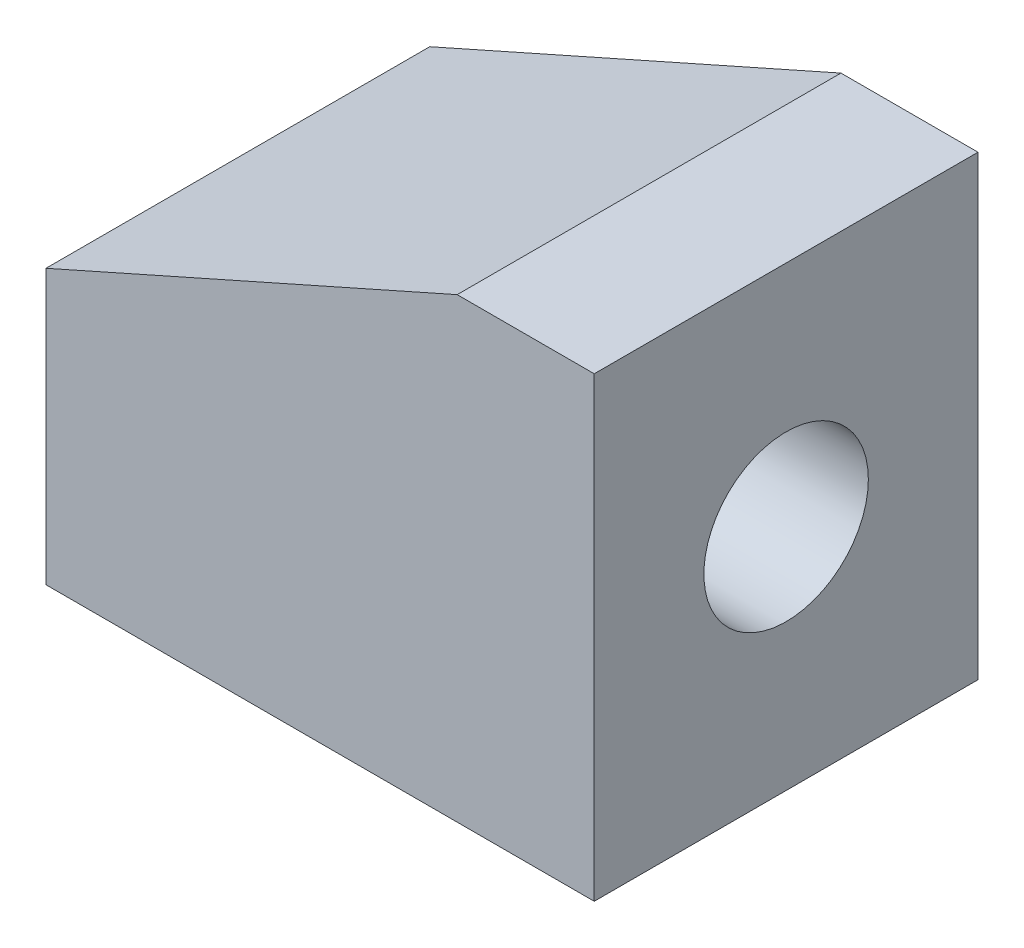
ISO-10303-21;
HEADER;
FILE_DESCRIPTION(('STEP AP214'),'2;1');
FILE_NAME('part.step','',(''),(''),'','','');
FILE_SCHEMA(('AUTOMOTIVE_DESIGN { 1 0 10303 214 1 1 1 1 }'));
ENDSEC;
DATA;
#1=APPLICATION_CONTEXT('core data for automotive mechanical design processes');
#2=APPLICATION_PROTOCOL_DEFINITION('international standard','automotive_design',2000,#1);
#3=PRODUCT_CONTEXT('',#1,'mechanical');
#4=PRODUCT('Part','Part','',(#3));
#5=PRODUCT_RELATED_PRODUCT_CATEGORY('part','',(#4));
#6=PRODUCT_DEFINITION_FORMATION('','',#4);
#7=PRODUCT_DEFINITION_CONTEXT('part definition',#1,'design');
#8=PRODUCT_DEFINITION('design','',#6,#7);
#9=PRODUCT_DEFINITION_SHAPE('','',#8);
#10=(LENGTH_UNIT() NAMED_UNIT(*) SI_UNIT(.MILLI.,.METRE.));
#11=(NAMED_UNIT(*) PLANE_ANGLE_UNIT() SI_UNIT($,.RADIAN.));
#12=(NAMED_UNIT(*) SI_UNIT($,.STERADIAN.) SOLID_ANGLE_UNIT());
#13=UNCERTAINTY_MEASURE_WITH_UNIT(LENGTH_MEASURE(1.E-05),#10,'distance_accuracy_value','');
#14=(GEOMETRIC_REPRESENTATION_CONTEXT(3) GLOBAL_UNCERTAINTY_ASSIGNED_CONTEXT((#13)) GLOBAL_UNIT_ASSIGNED_CONTEXT((#10,
#11,#12)) REPRESENTATION_CONTEXT('',''));
#15=CARTESIAN_POINT('',(0.,0.,0.));
#16=DIRECTION('',(0.,0.,1.));
#17=DIRECTION('',(1.,0.,0.));
#18=AXIS2_PLACEMENT_3D('',#15,#16,#17);
#19=CARTESIAN_POINT('',(-30.,30.,-42.));
#20=DIRECTION('',(-1.,0.,0.));
#21=DIRECTION('',(0.,0.,1.));
#22=AXIS2_PLACEMENT_3D('',#19,#20,#21);
#23=PLANE('',#22);
#24=DIRECTION('',(0.,-1.,0.));
#25=VECTOR('',#24,1.);
#26=CARTESIAN_POINT('',(-30.,30.,0.));
#27=LINE('',#26,#25);
#28=CARTESIAN_POINT('',(-30.,30.,0.));
#29=VERTEX_POINT('',#28);
#30=CARTESIAN_POINT('',(-30.,0.,0.));
#31=VERTEX_POINT('',#30);
#32=EDGE_CURVE('E126',#29,#31,#27,.T.);
#33=ORIENTED_EDGE('',*,*,#32,.F.);
#34=DIRECTION('',(0.,0.,1.));
#35=VECTOR('',#34,1.);
#36=CARTESIAN_POINT('',(-30.,30.,-42.));
#37=LINE('',#36,#35);
#38=CARTESIAN_POINT('',(-30.,30.,-42.));
#39=VERTEX_POINT('',#38);
#40=EDGE_CURVE('E11',#39,#29,#37,.T.);
#41=ORIENTED_EDGE('',*,*,#40,.F.);
#42=DIRECTION('',(0.,-1.,0.));
#43=VECTOR('',#42,1.);
#44=CARTESIAN_POINT('',(-30.,30.,-42.));
#45=LINE('',#44,#43);
#46=CARTESIAN_POINT('',(-30.,0.,-42.));
#47=VERTEX_POINT('',#46);
#48=EDGE_CURVE('E120',#39,#47,#45,.T.);
#49=ORIENTED_EDGE('',*,*,#48,.T.);
#50=DIRECTION('',(0.,0.,1.));
#51=VECTOR('',#50,1.);
#52=CARTESIAN_POINT('',(-30.,0.,-42.));
#53=LINE('',#52,#51);
#54=EDGE_CURVE('E46',#47,#31,#53,.T.);
#55=ORIENTED_EDGE('',*,*,#54,.T.);
#56=EDGE_LOOP('',(#33,#41,#49,#55));
#57=FACE_BOUND('',#56,.T.);
#58=ADVANCED_FACE('F43',(#57),#23,.T.);
#59=CARTESIAN_POINT('',(15.,50.,-42.));
#60=DIRECTION('',(-0.406138466053448,0.913811548620257,0.));
#61=DIRECTION('',(-0.913811548620257,-0.406138466053448,0.));
#62=AXIS2_PLACEMENT_3D('',#59,#60,#61);
#63=PLANE('',#62);
#64=DIRECTION('',(-0.913811548620257,-0.406138466053448,0.));
#65=VECTOR('',#64,1.);
#66=CARTESIAN_POINT('',(15.,50.,0.));
#67=LINE('',#66,#65);
#68=CARTESIAN_POINT('',(15.,50.,0.));
#69=VERTEX_POINT('',#68);
#70=EDGE_CURVE('E140',#69,#29,#67,.T.);
#71=ORIENTED_EDGE('',*,*,#70,.F.);
#72=DIRECTION('',(0.,0.,1.));
#73=VECTOR('',#72,1.);
#74=CARTESIAN_POINT('',(15.,50.,-42.));
#75=LINE('',#74,#73);
#76=CARTESIAN_POINT('',(15.,50.,-42.));
#77=VERTEX_POINT('',#76);
#78=EDGE_CURVE('E53',#77,#69,#75,.T.);
#79=ORIENTED_EDGE('',*,*,#78,.F.);
#80=DIRECTION('',(-0.913811548620257,-0.406138466053448,0.));
#81=VECTOR('',#80,1.);
#82=CARTESIAN_POINT('',(15.,50.,-42.));
#83=LINE('',#82,#81);
#84=EDGE_CURVE('E112',#77,#39,#83,.T.);
#85=ORIENTED_EDGE('',*,*,#84,.T.);
#86=ORIENTED_EDGE('',*,*,#40,.T.);
#87=EDGE_LOOP('',(#71,#79,#85,#86));
#88=FACE_BOUND('',#87,.T.);
#89=ADVANCED_FACE('F150',(#88),#63,.T.);
#90=CARTESIAN_POINT('',(30.,50.,-42.));
#91=DIRECTION('',(0.,1.,0.));
#92=DIRECTION('',(0.,0.,1.));
#93=AXIS2_PLACEMENT_3D('',#90,#91,#92);
#94=PLANE('',#93);
#95=DIRECTION('',(-1.,0.,0.));
#96=VECTOR('',#95,1.);
#97=CARTESIAN_POINT('',(30.,50.,0.));
#98=LINE('',#97,#96);
#99=CARTESIAN_POINT('',(30.,50.,0.));
#100=VERTEX_POINT('',#99);
#101=EDGE_CURVE('E100',#100,#69,#98,.T.);
#102=ORIENTED_EDGE('',*,*,#101,.F.);
#103=DIRECTION('',(0.,0.,1.));
#104=VECTOR('',#103,1.);
#105=CARTESIAN_POINT('',(30.,50.,-42.));
#106=LINE('',#105,#104);
#107=CARTESIAN_POINT('',(30.,50.,-42.));
#108=VERTEX_POINT('',#107);
#109=EDGE_CURVE('E95',#108,#100,#106,.T.);
#110=ORIENTED_EDGE('',*,*,#109,.F.);
#111=DIRECTION('',(-1.,0.,0.));
#112=VECTOR('',#111,1.);
#113=CARTESIAN_POINT('',(30.,50.,-42.));
#114=LINE('',#113,#112);
#115=EDGE_CURVE('E98',#108,#77,#114,.T.);
#116=ORIENTED_EDGE('',*,*,#115,.T.);
#117=ORIENTED_EDGE('',*,*,#78,.T.);
#118=EDGE_LOOP('',(#102,#110,#116,#117));
#119=FACE_BOUND('',#118,.T.);
#120=ADVANCED_FACE('F97',(#119),#94,.T.);
#121=CARTESIAN_POINT('',(30.,0.,-42.));
#122=DIRECTION('',(1.,0.,0.));
#123=DIRECTION('',(0.,0.,-1.));
#124=AXIS2_PLACEMENT_3D('',#121,#122,#123);
#125=PLANE('',#124);
#126=CARTESIAN_POINT('',(30.,25.,-21.));
#127=DIRECTION('',(1.,0.,0.));
#128=DIRECTION('',(0.,0.,-1.));
#129=AXIS2_PLACEMENT_3D('',#126,#127,#128);
#130=CIRCLE('',#129,9.00000000000001);
#131=CARTESIAN_POINT('',(30.,25.,-30.));
#132=VERTEX_POINT('',#131);
#133=EDGE_CURVE('E183',#132,#132,#130,.T.);
#134=ORIENTED_EDGE('',*,*,#133,.F.);
#135=EDGE_LOOP('',(#134));
#136=FACE_BOUND('',#135,.T.);
#137=DIRECTION('',(0.,1.,0.));
#138=VECTOR('',#137,1.);
#139=CARTESIAN_POINT('',(30.,0.,0.));
#140=LINE('',#139,#138);
#141=CARTESIAN_POINT('',(30.,0.,0.));
#142=VERTEX_POINT('',#141);
#143=EDGE_CURVE('E135',#142,#100,#140,.T.);
#144=ORIENTED_EDGE('',*,*,#143,.F.);
#145=DIRECTION('',(0.,0.,1.));
#146=VECTOR('',#145,1.);
#147=CARTESIAN_POINT('',(30.,0.,-42.));
#148=LINE('',#147,#146);
#149=CARTESIAN_POINT('',(30.,0.,-42.));
#150=VERTEX_POINT('',#149);
#151=EDGE_CURVE('E106',#150,#142,#148,.T.);
#152=ORIENTED_EDGE('',*,*,#151,.F.);
#153=DIRECTION('',(0.,1.,0.));
#154=VECTOR('',#153,1.);
#155=CARTESIAN_POINT('',(30.,0.,-42.));
#156=LINE('',#155,#154);
#157=EDGE_CURVE('E111',#150,#108,#156,.T.);
#158=ORIENTED_EDGE('',*,*,#157,.T.);
#159=ORIENTED_EDGE('',*,*,#109,.T.);
#160=EDGE_LOOP('',(#144,#152,#158,#159));
#161=FACE_BOUND('',#160,.T.);
#162=ADVANCED_FACE('F115',(#136,#161),#125,.T.);
#163=CARTESIAN_POINT('',(-30.,0.,-42.));
#164=DIRECTION('',(0.,-1.,0.));
#165=DIRECTION('',(1.,0.,0.));
#166=AXIS2_PLACEMENT_3D('',#163,#164,#165);
#167=PLANE('',#166);
#168=DIRECTION('',(1.,0.,0.));
#169=VECTOR('',#168,1.);
#170=CARTESIAN_POINT('',(-30.,0.,0.));
#171=LINE('',#170,#169);
#172=EDGE_CURVE('E130',#31,#142,#171,.T.);
#173=ORIENTED_EDGE('',*,*,#172,.F.);
#174=ORIENTED_EDGE('',*,*,#54,.F.);
#175=DIRECTION('',(1.,0.,0.));
#176=VECTOR('',#175,1.);
#177=CARTESIAN_POINT('',(-30.,0.,-42.));
#178=LINE('',#177,#176);
#179=EDGE_CURVE('E117',#47,#150,#178,.T.);
#180=ORIENTED_EDGE('',*,*,#179,.T.);
#181=ORIENTED_EDGE('',*,*,#151,.T.);
#182=EDGE_LOOP('',(#173,#174,#180,#181));
#183=FACE_BOUND('',#182,.T.);
#184=ADVANCED_FACE('F147',(#183),#167,.T.);
#185=CARTESIAN_POINT('',(0.,0.,-42.));
#186=DIRECTION('',(0.,0.,1.));
#187=DIRECTION('',(1.,0.,0.));
#188=AXIS2_PLACEMENT_3D('',#185,#186,#187);
#189=PLANE('',#188);
#190=ORIENTED_EDGE('',*,*,#48,.F.);
#191=ORIENTED_EDGE('',*,*,#84,.F.);
#192=ORIENTED_EDGE('',*,*,#115,.F.);
#193=ORIENTED_EDGE('',*,*,#157,.F.);
#194=ORIENTED_EDGE('',*,*,#179,.F.);
#195=EDGE_LOOP('',(#190,#191,#192,#193,#194));
#196=FACE_BOUND('',#195,.T.);
#197=ADVANCED_FACE('F110',(#196),#189,.F.);
#198=CARTESIAN_POINT('',(0.,0.,0.));
#199=DIRECTION('',(0.,0.,1.));
#200=DIRECTION('',(1.,0.,0.));
#201=AXIS2_PLACEMENT_3D('',#198,#199,#200);
#202=PLANE('',#201);
#203=ORIENTED_EDGE('',*,*,#32,.T.);
#204=ORIENTED_EDGE('',*,*,#172,.T.);
#205=ORIENTED_EDGE('',*,*,#143,.T.);
#206=ORIENTED_EDGE('',*,*,#101,.T.);
#207=ORIENTED_EDGE('',*,*,#70,.T.);
#208=EDGE_LOOP('',(#203,#204,#205,#206,#207));
#209=FACE_BOUND('',#208,.T.);
#210=ADVANCED_FACE('F149',(#209),#202,.T.);
#211=CARTESIAN_POINT('',(-10.,25.,-21.));
#212=DIRECTION('',(1.,0.,0.));
#213=DIRECTION('',(0.,0.,-1.));
#214=AXIS2_PLACEMENT_3D('',#211,#212,#213);
#215=CYLINDRICAL_SURFACE('',#214,9.00000000000001);
#216=CARTESIAN_POINT('',(-10.,25.,-21.));
#217=DIRECTION('',(1.,0.,0.));
#218=DIRECTION('',(0.,0.,-1.));
#219=AXIS2_PLACEMENT_3D('',#216,#217,#218);
#220=CIRCLE('',#219,9.00000000000001);
#221=CARTESIAN_POINT('',(-10.,25.,-30.));
#222=VERTEX_POINT('',#221);
#223=EDGE_CURVE('E131',#222,#222,#220,.T.);
#224=ORIENTED_EDGE('',*,*,#223,.F.);
#225=EDGE_LOOP('',(#224));
#226=FACE_BOUND('',#225,.T.);
#227=ORIENTED_EDGE('',*,*,#133,.T.);
#228=EDGE_LOOP('',(#227));
#229=FACE_BOUND('',#228,.T.);
#230=ADVANCED_FACE('F170',(#226,#229),#215,.F.);
#231=CARTESIAN_POINT('',(-10.,25.,-21.));
#232=DIRECTION('',(1.,0.,0.));
#233=DIRECTION('',(0.,0.,-1.));
#234=AXIS2_PLACEMENT_3D('',#231,#232,#233);
#235=PLANE('',#234);
#236=ORIENTED_EDGE('',*,*,#223,.T.);
#237=EDGE_LOOP('',(#236));
#238=FACE_BOUND('',#237,.T.);
#239=ADVANCED_FACE('F174',(#238),#235,.T.);
#240=CLOSED_SHELL('',(#58,#89,#120,#162,#184,#197,#210,#230,#239));
#241=MANIFOLD_SOLID_BREP('B2',#240);
#242=ADVANCED_BREP_SHAPE_REPRESENTATION('',(#18,#241),#14);
#243=SHAPE_DEFINITION_REPRESENTATION(#9,#242);
ENDSEC;
END-ISO-10303-21;
